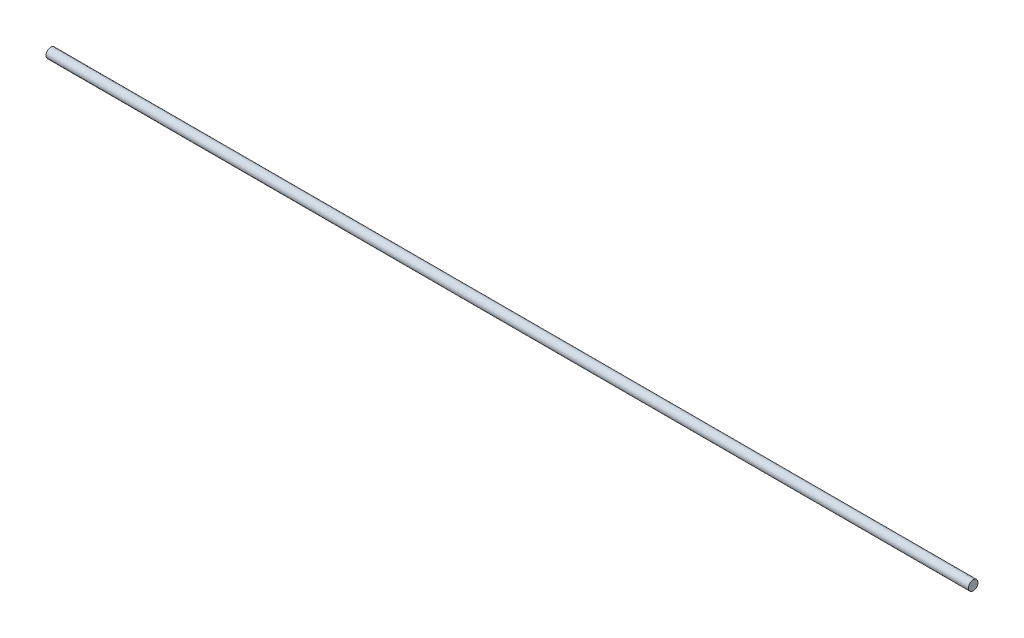
ISO-10303-21;
HEADER;
FILE_DESCRIPTION(('STEP AP214'),'2;1');
FILE_NAME('part.step','',(''),(''),'','','');
FILE_SCHEMA(('AUTOMOTIVE_DESIGN { 1 0 10303 214 1 1 1 1 }'));
ENDSEC;
DATA;
#1=APPLICATION_CONTEXT('core data for automotive mechanical design processes');
#2=APPLICATION_PROTOCOL_DEFINITION('international standard','automotive_design',2000,#1);
#3=PRODUCT_CONTEXT('',#1,'mechanical');
#4=PRODUCT('Part','Part','',(#3));
#5=PRODUCT_RELATED_PRODUCT_CATEGORY('part','',(#4));
#6=PRODUCT_DEFINITION_FORMATION('','',#4);
#7=PRODUCT_DEFINITION_CONTEXT('part definition',#1,'design');
#8=PRODUCT_DEFINITION('design','',#6,#7);
#9=PRODUCT_DEFINITION_SHAPE('','',#8);
#10=(LENGTH_UNIT() NAMED_UNIT(*) SI_UNIT(.MILLI.,.METRE.));
#11=(NAMED_UNIT(*) PLANE_ANGLE_UNIT() SI_UNIT($,.RADIAN.));
#12=(NAMED_UNIT(*) SI_UNIT($,.STERADIAN.) SOLID_ANGLE_UNIT());
#13=UNCERTAINTY_MEASURE_WITH_UNIT(LENGTH_MEASURE(1.E-05),#10,'distance_accuracy_value','');
#14=(GEOMETRIC_REPRESENTATION_CONTEXT(3) GLOBAL_UNCERTAINTY_ASSIGNED_CONTEXT((#13)) GLOBAL_UNIT_ASSIGNED_CONTEXT((#10,
#11,#12)) REPRESENTATION_CONTEXT('',''));
#15=CARTESIAN_POINT('',(0.,0.,0.));
#16=DIRECTION('',(0.,0.,1.));
#17=DIRECTION('',(1.,0.,0.));
#18=AXIS2_PLACEMENT_3D('',#15,#16,#17);
#19=CARTESIAN_POINT('',(150.,0.,0.));
#20=DIRECTION('',(-1.,0.,0.));
#21=DIRECTION('',(0.,0.,1.));
#22=AXIS2_PLACEMENT_3D('',#19,#20,#21);
#23=CYLINDRICAL_SURFACE('',#22,1.5625);
#24=CARTESIAN_POINT('',(150.,0.,0.));
#25=DIRECTION('',(1.,0.,0.));
#26=DIRECTION('',(0.,0.,-1.));
#27=AXIS2_PLACEMENT_3D('',#24,#25,#26);
#28=CIRCLE('',#27,1.5625);
#29=CARTESIAN_POINT('',(150.,0.,-1.5625));
#30=VERTEX_POINT('',#29);
#31=EDGE_CURVE('E10',#30,#30,#28,.T.);
#32=ORIENTED_EDGE('',*,*,#31,.F.);
#33=EDGE_LOOP('',(#32));
#34=FACE_BOUND('',#33,.T.);
#35=CARTESIAN_POINT('',(-150.,0.,0.));
#36=DIRECTION('',(1.,0.,0.));
#37=DIRECTION('',(0.,0.,-1.));
#38=AXIS2_PLACEMENT_3D('',#35,#36,#37);
#39=CIRCLE('',#38,1.5625);
#40=CARTESIAN_POINT('',(-150.,0.,-1.5625));
#41=VERTEX_POINT('',#40);
#42=EDGE_CURVE('E40',#41,#41,#39,.T.);
#43=ORIENTED_EDGE('',*,*,#42,.T.);
#44=EDGE_LOOP('',(#43));
#45=FACE_BOUND('',#44,.T.);
#46=ADVANCED_FACE('F37',(#34,#45),#23,.T.);
#47=CARTESIAN_POINT('',(150.,0.,0.));
#48=DIRECTION('',(1.,0.,0.));
#49=DIRECTION('',(0.,0.,-1.));
#50=AXIS2_PLACEMENT_3D('',#47,#48,#49);
#51=PLANE('',#50);
#52=ORIENTED_EDGE('',*,*,#31,.T.);
#53=EDGE_LOOP('',(#52));
#54=FACE_BOUND('',#53,.T.);
#55=ADVANCED_FACE('F54',(#54),#51,.T.);
#56=CARTESIAN_POINT('',(-150.,0.,0.));
#57=DIRECTION('',(1.,0.,0.));
#58=DIRECTION('',(0.,0.,-1.));
#59=AXIS2_PLACEMENT_3D('',#56,#57,#58);
#60=PLANE('',#59);
#61=ORIENTED_EDGE('',*,*,#42,.F.);
#62=EDGE_LOOP('',(#61));
#63=FACE_BOUND('',#62,.T.);
#64=ADVANCED_FACE('F52',(#63),#60,.F.);
#65=CLOSED_SHELL('',(#46,#55,#64));
#66=MANIFOLD_SOLID_BREP('B2',#65);
#67=ADVANCED_BREP_SHAPE_REPRESENTATION('',(#18,#66),#14);
#68=SHAPE_DEFINITION_REPRESENTATION(#9,#67);
ENDSEC;
END-ISO-10303-21;
